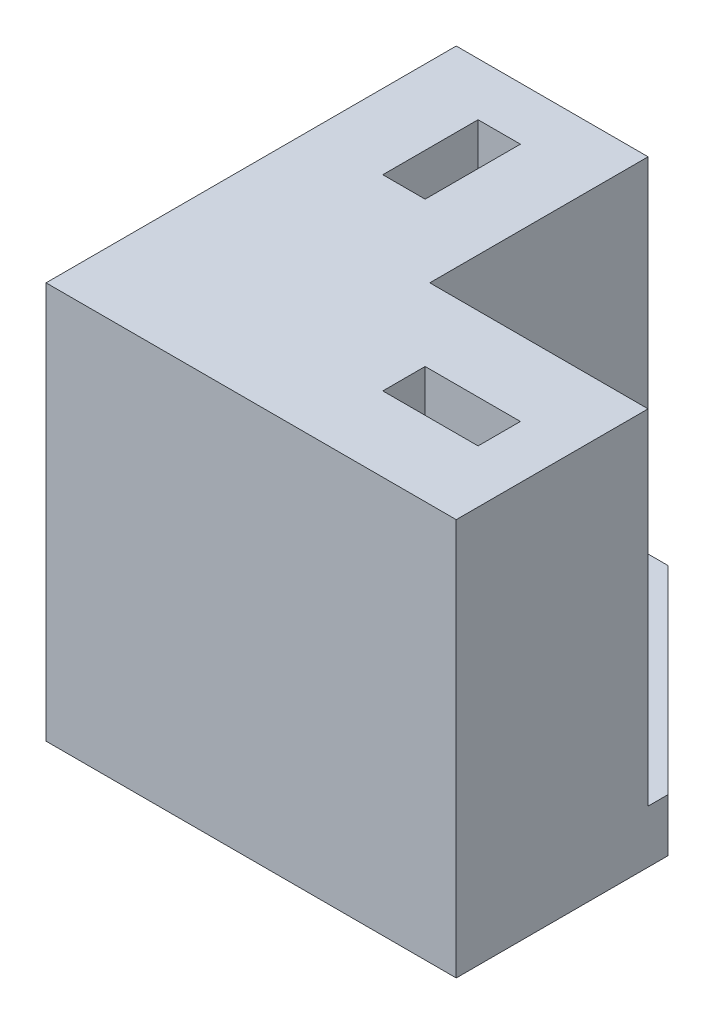
ISO-10303-21;
HEADER;
FILE_DESCRIPTION(('STEP AP214'),'2;1');
FILE_NAME('part.step','',(''),(''),'','','');
FILE_SCHEMA(('AUTOMOTIVE_DESIGN { 1 0 10303 214 1 1 1 1 }'));
ENDSEC;
DATA;
#1=APPLICATION_CONTEXT('core data for automotive mechanical design processes');
#2=APPLICATION_PROTOCOL_DEFINITION('international standard','automotive_design',2000,#1);
#3=PRODUCT_CONTEXT('',#1,'mechanical');
#4=PRODUCT('Part','Part','',(#3));
#5=PRODUCT_RELATED_PRODUCT_CATEGORY('part','',(#4));
#6=PRODUCT_DEFINITION_FORMATION('','',#4);
#7=PRODUCT_DEFINITION_CONTEXT('part definition',#1,'design');
#8=PRODUCT_DEFINITION('design','',#6,#7);
#9=PRODUCT_DEFINITION_SHAPE('','',#8);
#10=(LENGTH_UNIT() NAMED_UNIT(*) SI_UNIT(.MILLI.,.METRE.));
#11=(NAMED_UNIT(*) PLANE_ANGLE_UNIT() SI_UNIT($,.RADIAN.));
#12=(NAMED_UNIT(*) SI_UNIT($,.STERADIAN.) SOLID_ANGLE_UNIT());
#13=UNCERTAINTY_MEASURE_WITH_UNIT(LENGTH_MEASURE(1.E-05),#10,'distance_accuracy_value','');
#14=(GEOMETRIC_REPRESENTATION_CONTEXT(3) GLOBAL_UNCERTAINTY_ASSIGNED_CONTEXT((#13)) GLOBAL_UNIT_ASSIGNED_CONTEXT((#10,
#11,#12)) REPRESENTATION_CONTEXT('',''));
#15=CARTESIAN_POINT('',(0.,0.,0.));
#16=DIRECTION('',(0.,0.,1.));
#17=DIRECTION('',(1.,0.,0.));
#18=AXIS2_PLACEMENT_3D('',#15,#16,#17);
#19=CARTESIAN_POINT('',(9.8425,19.05,9.8425));
#20=DIRECTION('',(-1.,0.,0.));
#21=DIRECTION('',(0.,0.,1.));
#22=AXIS2_PLACEMENT_3D('',#19,#20,#21);
#23=PLANE('',#22);
#24=DIRECTION('',(0.,0.,-1.));
#25=VECTOR('',#24,1.);
#26=CARTESIAN_POINT('',(9.8425,0.,9.8425));
#27=LINE('',#26,#25);
#28=CARTESIAN_POINT('',(9.8425,0.,9.8425));
#29=VERTEX_POINT('',#28);
#30=CARTESIAN_POINT('',(9.8425,0.,-0.317499999999962));
#31=VERTEX_POINT('',#30);
#32=EDGE_CURVE('E287',#29,#31,#27,.T.);
#33=ORIENTED_EDGE('',*,*,#32,.T.);
#34=DIRECTION('',(0.,1.,0.));
#35=VECTOR('',#34,1.);
#36=CARTESIAN_POINT('',(9.8425,19.05,-0.317499999999962));
#37=LINE('',#36,#35);
#38=CARTESIAN_POINT('',(9.8425,2.54,-0.317499999999962));
#39=VERTEX_POINT('',#38);
#40=EDGE_CURVE('E48',#31,#39,#37,.T.);
#41=ORIENTED_EDGE('',*,*,#40,.T.);
#42=DIRECTION('',(0.,0.,-1.));
#43=VECTOR('',#42,1.);
#44=CARTESIAN_POINT('',(9.8425,2.54,-9.8425));
#45=LINE('',#44,#43);
#46=CARTESIAN_POINT('',(9.8425,2.54,0.634999999999998));
#47=VERTEX_POINT('',#46);
#48=EDGE_CURVE('E252',#47,#39,#45,.T.);
#49=ORIENTED_EDGE('',*,*,#48,.F.);
#50=DIRECTION('',(0.,1.,0.));
#51=VECTOR('',#50,1.);
#52=CARTESIAN_POINT('',(9.8425,2.54,0.634999999999998));
#53=LINE('',#52,#51);
#54=CARTESIAN_POINT('',(9.8425,19.05,0.634999999999998));
#55=VERTEX_POINT('',#54);
#56=EDGE_CURVE('E273',#47,#55,#53,.T.);
#57=ORIENTED_EDGE('',*,*,#56,.T.);
#58=DIRECTION('',(0.,0.,-1.));
#59=VECTOR('',#58,1.);
#60=CARTESIAN_POINT('',(9.8425,19.05,9.8425));
#61=LINE('',#60,#59);
#62=CARTESIAN_POINT('',(9.8425,19.05,9.8425));
#63=VERTEX_POINT('',#62);
#64=EDGE_CURVE('E291',#63,#55,#61,.T.);
#65=ORIENTED_EDGE('',*,*,#64,.F.);
#66=DIRECTION('',(0.,-1.,0.));
#67=VECTOR('',#66,1.);
#68=CARTESIAN_POINT('',(9.8425,19.05,9.8425));
#69=LINE('',#68,#67);
#70=EDGE_CURVE('E305',#63,#29,#69,.T.);
#71=ORIENTED_EDGE('',*,*,#70,.T.);
#72=EDGE_LOOP('',(#33,#41,#49,#57,#65,#71));
#73=FACE_BOUND('',#72,.T.);
#74=ADVANCED_FACE('F39',(#73),#23,.F.);
#75=CARTESIAN_POINT('',(-9.8425,19.05,-9.8425));
#76=DIRECTION('',(0.,0.,1.));
#77=DIRECTION('',(1.,0.,0.));
#78=AXIS2_PLACEMENT_3D('',#75,#76,#77);
#79=PLANE('',#78);
#80=DIRECTION('',(-1.,0.,0.));
#81=VECTOR('',#80,1.);
#82=CARTESIAN_POINT('',(-0.634999999999997,2.54,-9.8425));
#83=LINE('',#82,#81);
#84=CARTESIAN_POINT('',(0.3175,2.54,-9.8425));
#85=VERTEX_POINT('',#84);
#86=CARTESIAN_POINT('',(-0.634999999999997,2.54,-9.8425));
#87=VERTEX_POINT('',#86);
#88=EDGE_CURVE('E255',#85,#87,#83,.T.);
#89=ORIENTED_EDGE('',*,*,#88,.F.);
#90=DIRECTION('',(0.,-1.,0.));
#91=VECTOR('',#90,1.);
#92=CARTESIAN_POINT('',(0.3175,19.05,-9.8425));
#93=LINE('',#92,#91);
#94=CARTESIAN_POINT('',(0.3175,0.,-9.8425));
#95=VERTEX_POINT('',#94);
#96=EDGE_CURVE('E327',#85,#95,#93,.T.);
#97=ORIENTED_EDGE('',*,*,#96,.T.);
#98=DIRECTION('',(-1.,0.,0.));
#99=VECTOR('',#98,1.);
#100=CARTESIAN_POINT('',(-9.8425,0.,-9.8425));
#101=LINE('',#100,#99);
#102=CARTESIAN_POINT('',(-9.8425,0.,-9.8425));
#103=VERTEX_POINT('',#102);
#104=EDGE_CURVE('E308',#95,#103,#101,.T.);
#105=ORIENTED_EDGE('',*,*,#104,.T.);
#106=DIRECTION('',(0.,-1.,0.));
#107=VECTOR('',#106,1.);
#108=CARTESIAN_POINT('',(-9.8425,19.05,-9.8425));
#109=LINE('',#108,#107);
#110=CARTESIAN_POINT('',(-9.8425,19.05,-9.8425));
#111=VERTEX_POINT('',#110);
#112=EDGE_CURVE('E323',#111,#103,#109,.T.);
#113=ORIENTED_EDGE('',*,*,#112,.F.);
#114=DIRECTION('',(-1.,0.,0.));
#115=VECTOR('',#114,1.);
#116=CARTESIAN_POINT('',(-9.8425,19.05,-9.8425));
#117=LINE('',#116,#115);
#118=CARTESIAN_POINT('',(-0.634999999999997,19.05,-9.8425));
#119=VERTEX_POINT('',#118);
#120=EDGE_CURVE('E295',#119,#111,#117,.T.);
#121=ORIENTED_EDGE('',*,*,#120,.F.);
#122=DIRECTION('',(0.,1.,0.));
#123=VECTOR('',#122,1.);
#124=CARTESIAN_POINT('',(-0.634999999999997,2.54,-9.8425));
#125=LINE('',#124,#123);
#126=EDGE_CURVE('E267',#87,#119,#125,.T.);
#127=ORIENTED_EDGE('',*,*,#126,.F.);
#128=EDGE_LOOP('',(#89,#97,#105,#113,#121,#127));
#129=FACE_BOUND('',#128,.T.);
#130=ADVANCED_FACE('F336',(#129),#79,.F.);
#131=CARTESIAN_POINT('',(-9.8425,19.05,9.8425));
#132=DIRECTION('',(1.,0.,0.));
#133=DIRECTION('',(0.,0.,-1.));
#134=AXIS2_PLACEMENT_3D('',#131,#132,#133);
#135=PLANE('',#134);
#136=DIRECTION('',(0.,0.,1.));
#137=VECTOR('',#136,1.);
#138=CARTESIAN_POINT('',(-9.8425,0.,9.8425));
#139=LINE('',#138,#137);
#140=CARTESIAN_POINT('',(-9.8425,0.,9.8425));
#141=VERTEX_POINT('',#140);
#142=EDGE_CURVE('E311',#103,#141,#139,.T.);
#143=ORIENTED_EDGE('',*,*,#142,.T.);
#144=DIRECTION('',(0.,-1.,0.));
#145=VECTOR('',#144,1.);
#146=CARTESIAN_POINT('',(-9.8425,19.05,9.8425));
#147=LINE('',#146,#145);
#148=CARTESIAN_POINT('',(-9.8425,19.05,9.8425));
#149=VERTEX_POINT('',#148);
#150=EDGE_CURVE('E319',#149,#141,#147,.T.);
#151=ORIENTED_EDGE('',*,*,#150,.F.);
#152=DIRECTION('',(0.,0.,1.));
#153=VECTOR('',#152,1.);
#154=CARTESIAN_POINT('',(-9.8425,19.05,9.8425));
#155=LINE('',#154,#153);
#156=EDGE_CURVE('E299',#111,#149,#155,.T.);
#157=ORIENTED_EDGE('',*,*,#156,.F.);
#158=ORIENTED_EDGE('',*,*,#112,.T.);
#159=EDGE_LOOP('',(#143,#151,#157,#158));
#160=FACE_BOUND('',#159,.T.);
#161=ADVANCED_FACE('F346',(#160),#135,.F.);
#162=CARTESIAN_POINT('',(-9.8425,19.05,9.8425));
#163=DIRECTION('',(0.,0.,-1.));
#164=DIRECTION('',(-1.,0.,0.));
#165=AXIS2_PLACEMENT_3D('',#162,#163,#164);
#166=PLANE('',#165);
#167=DIRECTION('',(1.,0.,0.));
#168=VECTOR('',#167,1.);
#169=CARTESIAN_POINT('',(-9.8425,0.,9.8425));
#170=LINE('',#169,#168);
#171=EDGE_CURVE('E296',#141,#29,#170,.T.);
#172=ORIENTED_EDGE('',*,*,#171,.T.);
#173=ORIENTED_EDGE('',*,*,#70,.F.);
#174=DIRECTION('',(1.,0.,0.));
#175=VECTOR('',#174,1.);
#176=CARTESIAN_POINT('',(-9.8425,19.05,9.8425));
#177=LINE('',#176,#175);
#178=EDGE_CURVE('E302',#149,#63,#177,.T.);
#179=ORIENTED_EDGE('',*,*,#178,.F.);
#180=ORIENTED_EDGE('',*,*,#150,.T.);
#181=EDGE_LOOP('',(#172,#173,#179,#180));
#182=FACE_BOUND('',#181,.T.);
#183=ADVANCED_FACE('F350',(#182),#166,.F.);
#184=CARTESIAN_POINT('',(0.,19.05,0.));
#185=DIRECTION('',(0.,-1.,0.));
#186=DIRECTION('',(0.,0.,-1.));
#187=AXIS2_PLACEMENT_3D('',#184,#185,#186);
#188=PLANE('',#187);
#189=DIRECTION('',(-1.,0.,0.));
#190=VECTOR('',#189,1.);
#191=CARTESIAN_POINT('',(-6.25475,19.05,-7.3025));
#192=LINE('',#191,#190);
#193=CARTESIAN_POINT('',(-4.22275,19.05,-7.3025));
#194=VERTEX_POINT('',#193);
#195=CARTESIAN_POINT('',(-6.25475,19.05,-7.3025));
#196=VERTEX_POINT('',#195);
#197=EDGE_CURVE('E193',#194,#196,#192,.T.);
#198=ORIENTED_EDGE('',*,*,#197,.F.);
#199=DIRECTION('',(0.,0.,-1.));
#200=VECTOR('',#199,1.);
#201=CARTESIAN_POINT('',(-4.22275,19.05,-2.7305));
#202=LINE('',#201,#200);
#203=CARTESIAN_POINT('',(-4.22275,19.05,-2.7305));
#204=VERTEX_POINT('',#203);
#205=EDGE_CURVE('E160',#204,#194,#202,.T.);
#206=ORIENTED_EDGE('',*,*,#205,.F.);
#207=DIRECTION('',(1.,0.,0.));
#208=VECTOR('',#207,1.);
#209=CARTESIAN_POINT('',(-6.25475,19.05,-2.7305));
#210=LINE('',#209,#208);
#211=CARTESIAN_POINT('',(-6.25475,19.05,-2.7305));
#212=VERTEX_POINT('',#211);
#213=EDGE_CURVE('E180',#212,#204,#210,.T.);
#214=ORIENTED_EDGE('',*,*,#213,.F.);
#215=DIRECTION('',(0.,0.,1.));
#216=VECTOR('',#215,1.);
#217=CARTESIAN_POINT('',(-6.25475,19.05,-2.7305));
#218=LINE('',#217,#216);
#219=EDGE_CURVE('E184',#196,#212,#218,.T.);
#220=ORIENTED_EDGE('',*,*,#219,.F.);
#221=EDGE_LOOP('',(#198,#206,#214,#220));
#222=FACE_BOUND('',#221,.T.);
#223=DIRECTION('',(-1.,0.,0.));
#224=VECTOR('',#223,1.);
#225=CARTESIAN_POINT('',(2.7305,19.05,4.22275));
#226=LINE('',#225,#224);
#227=CARTESIAN_POINT('',(7.3025,19.05,4.22275));
#228=VERTEX_POINT('',#227);
#229=CARTESIAN_POINT('',(2.7305,19.05,4.22275));
#230=VERTEX_POINT('',#229);
#231=EDGE_CURVE('E230',#228,#230,#226,.T.);
#232=ORIENTED_EDGE('',*,*,#231,.F.);
#233=DIRECTION('',(0.,0.,-1.));
#234=VECTOR('',#233,1.);
#235=CARTESIAN_POINT('',(7.3025,19.05,6.25475));
#236=LINE('',#235,#234);
#237=CARTESIAN_POINT('',(7.3025,19.05,6.25475));
#238=VERTEX_POINT('',#237);
#239=EDGE_CURVE('E227',#238,#228,#236,.T.);
#240=ORIENTED_EDGE('',*,*,#239,.F.);
#241=DIRECTION('',(1.,0.,0.));
#242=VECTOR('',#241,1.);
#243=CARTESIAN_POINT('',(2.7305,19.05,6.25475));
#244=LINE('',#243,#242);
#245=CARTESIAN_POINT('',(2.7305,19.05,6.25475));
#246=VERTEX_POINT('',#245);
#247=EDGE_CURVE('E214',#246,#238,#244,.T.);
#248=ORIENTED_EDGE('',*,*,#247,.F.);
#249=DIRECTION('',(0.,0.,1.));
#250=VECTOR('',#249,1.);
#251=CARTESIAN_POINT('',(2.7305,19.05,6.25475));
#252=LINE('',#251,#250);
#253=EDGE_CURVE('E234',#230,#246,#252,.T.);
#254=ORIENTED_EDGE('',*,*,#253,.F.);
#255=EDGE_LOOP('',(#232,#240,#248,#254));
#256=FACE_BOUND('',#255,.T.);
#257=ORIENTED_EDGE('',*,*,#64,.T.);
#258=DIRECTION('',(1.,0.,0.));
#259=VECTOR('',#258,1.);
#260=CARTESIAN_POINT('',(9.8425,19.05,0.634999999999998));
#261=LINE('',#260,#259);
#262=CARTESIAN_POINT('',(-0.634999999999997,19.05,0.635));
#263=VERTEX_POINT('',#262);
#264=EDGE_CURVE('E256',#263,#55,#261,.T.);
#265=ORIENTED_EDGE('',*,*,#264,.F.);
#266=DIRECTION('',(0.,0.,1.));
#267=VECTOR('',#266,1.);
#268=CARTESIAN_POINT('',(-0.634999999999997,19.05,0.635));
#269=LINE('',#268,#267);
#270=EDGE_CURVE('E203',#119,#263,#269,.T.);
#271=ORIENTED_EDGE('',*,*,#270,.F.);
#272=ORIENTED_EDGE('',*,*,#120,.T.);
#273=ORIENTED_EDGE('',*,*,#156,.T.);
#274=ORIENTED_EDGE('',*,*,#178,.T.);
#275=EDGE_LOOP('',(#257,#265,#271,#272,#273,#274));
#276=FACE_BOUND('',#275,.T.);
#277=ADVANCED_FACE('F354',(#222,#256,#276),#188,.F.);
#278=CARTESIAN_POINT('',(0.,0.,0.));
#279=DIRECTION('',(0.,-1.,0.));
#280=DIRECTION('',(0.,0.,-1.));
#281=AXIS2_PLACEMENT_3D('',#278,#279,#280);
#282=PLANE('',#281);
#283=CARTESIAN_POINT('',(-4.92125,0.,4.92125));
#284=DIRECTION('',(0.,-1.,0.));
#285=DIRECTION('',(0.,0.,-1.));
#286=AXIS2_PLACEMENT_3D('',#283,#284,#285);
#287=CIRCLE('',#286,2.54);
#288=CARTESIAN_POINT('',(-4.92125,0.,2.38125));
#289=VERTEX_POINT('',#288);
#290=EDGE_CURVE('E277',#289,#289,#287,.T.);
#291=ORIENTED_EDGE('',*,*,#290,.F.);
#292=EDGE_LOOP('',(#291));
#293=FACE_BOUND('',#292,.T.);
#294=ORIENTED_EDGE('',*,*,#104,.F.);
#295=DIRECTION('',(-0.707106781186546,0.,-0.707106781186549));
#296=VECTOR('',#295,1.);
#297=CARTESIAN_POINT('',(5.08,0.,-5.07999999999998));
#298=LINE('',#297,#296);
#299=EDGE_CURVE('E62',#95,#31,#298,.F.);
#300=ORIENTED_EDGE('',*,*,#299,.T.);
#301=ORIENTED_EDGE('',*,*,#32,.F.);
#302=ORIENTED_EDGE('',*,*,#171,.F.);
#303=ORIENTED_EDGE('',*,*,#142,.F.);
#304=EDGE_LOOP('',(#294,#300,#301,#302,#303));
#305=FACE_BOUND('',#304,.T.);
#306=ADVANCED_FACE('F342',(#293,#305),#282,.T.);
#307=CARTESIAN_POINT('',(-4.92125,5.715,4.92125));
#308=DIRECTION('',(0.,-1.,0.));
#309=DIRECTION('',(0.,0.,-1.));
#310=AXIS2_PLACEMENT_3D('',#307,#308,#309);
#311=CYLINDRICAL_SURFACE('',#310,2.54);
#312=CARTESIAN_POINT('',(-4.92125,5.715,4.92125));
#313=DIRECTION('',(0.,-1.,0.));
#314=DIRECTION('',(0.,0.,-1.));
#315=AXIS2_PLACEMENT_3D('',#312,#313,#314);
#316=CIRCLE('',#315,2.54);
#317=CARTESIAN_POINT('',(-4.92125,5.715,2.38125));
#318=VERTEX_POINT('',#317);
#319=EDGE_CURVE('E283',#318,#318,#316,.T.);
#320=ORIENTED_EDGE('',*,*,#319,.F.);
#321=EDGE_LOOP('',(#320));
#322=FACE_BOUND('',#321,.T.);
#323=ORIENTED_EDGE('',*,*,#290,.T.);
#324=EDGE_LOOP('',(#323));
#325=FACE_BOUND('',#324,.T.);
#326=ADVANCED_FACE('F383',(#322,#325),#311,.F.);
#327=CARTESIAN_POINT('',(-4.92125,5.715,4.92125));
#328=DIRECTION('',(0.,-1.,0.));
#329=DIRECTION('',(0.,0.,-1.));
#330=AXIS2_PLACEMENT_3D('',#327,#328,#329);
#331=PLANE('',#330);
#332=ORIENTED_EDGE('',*,*,#319,.T.);
#333=EDGE_LOOP('',(#332));
#334=FACE_BOUND('',#333,.T.);
#335=ADVANCED_FACE('F390',(#334),#331,.T.);
#336=CARTESIAN_POINT('',(9.8425,2.54,0.634999999999998));
#337=DIRECTION('',(0.,0.,1.));
#338=DIRECTION('',(1.,0.,0.));
#339=AXIS2_PLACEMENT_3D('',#336,#337,#338);
#340=PLANE('',#339);
#341=ORIENTED_EDGE('',*,*,#264,.T.);
#342=ORIENTED_EDGE('',*,*,#56,.F.);
#343=DIRECTION('',(1.,0.,0.));
#344=VECTOR('',#343,1.);
#345=CARTESIAN_POINT('',(9.8425,2.54,0.634999999999998));
#346=LINE('',#345,#344);
#347=CARTESIAN_POINT('',(-0.634999999999997,2.54,0.635));
#348=VERTEX_POINT('',#347);
#349=EDGE_CURVE('E263',#348,#47,#346,.T.);
#350=ORIENTED_EDGE('',*,*,#349,.F.);
#351=DIRECTION('',(0.,1.,0.));
#352=VECTOR('',#351,1.);
#353=CARTESIAN_POINT('',(-0.634999999999997,2.54,0.635));
#354=LINE('',#353,#352);
#355=EDGE_CURVE('E278',#348,#263,#354,.T.);
#356=ORIENTED_EDGE('',*,*,#355,.T.);
#357=EDGE_LOOP('',(#341,#342,#350,#356));
#358=FACE_BOUND('',#357,.T.);
#359=ADVANCED_FACE('F365',(#358),#340,.F.);
#360=CARTESIAN_POINT('',(-0.634999999999997,2.54,0.635));
#361=DIRECTION('',(-1.,0.,0.));
#362=DIRECTION('',(0.,0.,1.));
#363=AXIS2_PLACEMENT_3D('',#360,#361,#362);
#364=PLANE('',#363);
#365=ORIENTED_EDGE('',*,*,#270,.T.);
#366=ORIENTED_EDGE('',*,*,#355,.F.);
#367=DIRECTION('',(0.,0.,1.));
#368=VECTOR('',#367,1.);
#369=CARTESIAN_POINT('',(-0.634999999999997,2.54,0.635));
#370=LINE('',#369,#368);
#371=EDGE_CURVE('E259',#87,#348,#370,.T.);
#372=ORIENTED_EDGE('',*,*,#371,.F.);
#373=ORIENTED_EDGE('',*,*,#126,.T.);
#374=EDGE_LOOP('',(#365,#366,#372,#373));
#375=FACE_BOUND('',#374,.T.);
#376=ADVANCED_FACE('F360',(#375),#364,.F.);
#377=CARTESIAN_POINT('',(0.,2.54,0.));
#378=DIRECTION('',(0.,-1.,0.));
#379=DIRECTION('',(0.,0.,-1.));
#380=AXIS2_PLACEMENT_3D('',#377,#378,#379);
#381=PLANE('',#380);
#382=ORIENTED_EDGE('',*,*,#48,.T.);
#383=DIRECTION('',(0.707106781186546,0.,0.707106781186549));
#384=VECTOR('',#383,1.);
#385=CARTESIAN_POINT('',(0.3175,2.54,-9.8425));
#386=LINE('',#385,#384);
#387=EDGE_CURVE('E11',#39,#85,#386,.F.);
#388=ORIENTED_EDGE('',*,*,#387,.T.);
#389=ORIENTED_EDGE('',*,*,#88,.T.);
#390=ORIENTED_EDGE('',*,*,#371,.T.);
#391=ORIENTED_EDGE('',*,*,#349,.T.);
#392=EDGE_LOOP('',(#382,#388,#389,#390,#391));
#393=FACE_BOUND('',#392,.T.);
#394=ADVANCED_FACE('F363',(#393),#381,.F.);
#395=CARTESIAN_POINT('',(7.3025,13.97,6.25475));
#396=DIRECTION('',(1.,0.,0.));
#397=DIRECTION('',(0.,0.,-1.));
#398=AXIS2_PLACEMENT_3D('',#395,#396,#397);
#399=PLANE('',#398);
#400=ORIENTED_EDGE('',*,*,#239,.T.);
#401=DIRECTION('',(0.,1.,0.));
#402=VECTOR('',#401,1.);
#403=CARTESIAN_POINT('',(7.3025,13.97,4.22275));
#404=LINE('',#403,#402);
#405=CARTESIAN_POINT('',(7.3025,13.97,4.22275));
#406=VERTEX_POINT('',#405);
#407=EDGE_CURVE('E226',#406,#228,#404,.T.);
#408=ORIENTED_EDGE('',*,*,#407,.F.);
#409=DIRECTION('',(0.,0.,-1.));
#410=VECTOR('',#409,1.);
#411=CARTESIAN_POINT('',(7.3025,13.97,6.25475));
#412=LINE('',#411,#410);
#413=CARTESIAN_POINT('',(7.3025,13.97,6.25475));
#414=VERTEX_POINT('',#413);
#415=EDGE_CURVE('E209',#414,#406,#412,.T.);
#416=ORIENTED_EDGE('',*,*,#415,.F.);
#417=DIRECTION('',(0.,1.,0.));
#418=VECTOR('',#417,1.);
#419=CARTESIAN_POINT('',(7.3025,13.97,6.25475));
#420=LINE('',#419,#418);
#421=EDGE_CURVE('E194',#414,#238,#420,.T.);
#422=ORIENTED_EDGE('',*,*,#421,.T.);
#423=EDGE_LOOP('',(#400,#408,#416,#422));
#424=FACE_BOUND('',#423,.T.);
#425=ADVANCED_FACE('F401',(#424),#399,.F.);
#426=CARTESIAN_POINT('',(2.7305,13.97,6.25475));
#427=DIRECTION('',(0.,0.,1.));
#428=DIRECTION('',(1.,0.,0.));
#429=AXIS2_PLACEMENT_3D('',#426,#427,#428);
#430=PLANE('',#429);
#431=ORIENTED_EDGE('',*,*,#247,.T.);
#432=ORIENTED_EDGE('',*,*,#421,.F.);
#433=DIRECTION('',(1.,0.,0.));
#434=VECTOR('',#433,1.);
#435=CARTESIAN_POINT('',(2.7305,13.97,6.25475));
#436=LINE('',#435,#434);
#437=CARTESIAN_POINT('',(2.7305,13.97,6.25475));
#438=VERTEX_POINT('',#437);
#439=EDGE_CURVE('E222',#438,#414,#436,.T.);
#440=ORIENTED_EDGE('',*,*,#439,.F.);
#441=DIRECTION('',(0.,1.,0.));
#442=VECTOR('',#441,1.);
#443=CARTESIAN_POINT('',(2.7305,13.97,6.25475));
#444=LINE('',#443,#442);
#445=EDGE_CURVE('E243',#438,#246,#444,.T.);
#446=ORIENTED_EDGE('',*,*,#445,.T.);
#447=EDGE_LOOP('',(#431,#432,#440,#446));
#448=FACE_BOUND('',#447,.T.);
#449=ADVANCED_FACE('F404',(#448),#430,.F.);
#450=CARTESIAN_POINT('',(2.7305,13.97,6.25475));
#451=DIRECTION('',(-1.,0.,0.));
#452=DIRECTION('',(0.,0.,1.));
#453=AXIS2_PLACEMENT_3D('',#450,#451,#452);
#454=PLANE('',#453);
#455=ORIENTED_EDGE('',*,*,#253,.T.);
#456=ORIENTED_EDGE('',*,*,#445,.F.);
#457=DIRECTION('',(0.,0.,1.));
#458=VECTOR('',#457,1.);
#459=CARTESIAN_POINT('',(2.7305,13.97,6.25475));
#460=LINE('',#459,#458);
#461=CARTESIAN_POINT('',(2.7305,13.97,4.22275));
#462=VERTEX_POINT('',#461);
#463=EDGE_CURVE('E218',#462,#438,#460,.T.);
#464=ORIENTED_EDGE('',*,*,#463,.F.);
#465=DIRECTION('',(0.,1.,0.));
#466=VECTOR('',#465,1.);
#467=CARTESIAN_POINT('',(2.7305,13.97,4.22275));
#468=LINE('',#467,#466);
#469=EDGE_CURVE('E246',#462,#230,#468,.T.);
#470=ORIENTED_EDGE('',*,*,#469,.T.);
#471=EDGE_LOOP('',(#455,#456,#464,#470));
#472=FACE_BOUND('',#471,.T.);
#473=ADVANCED_FACE('F410',(#472),#454,.F.);
#474=CARTESIAN_POINT('',(2.7305,13.97,4.22275));
#475=DIRECTION('',(0.,0.,-1.));
#476=DIRECTION('',(-1.,0.,0.));
#477=AXIS2_PLACEMENT_3D('',#474,#475,#476);
#478=PLANE('',#477);
#479=ORIENTED_EDGE('',*,*,#231,.T.);
#480=ORIENTED_EDGE('',*,*,#469,.F.);
#481=DIRECTION('',(-1.,0.,0.));
#482=VECTOR('',#481,1.);
#483=CARTESIAN_POINT('',(2.7305,13.97,4.22275));
#484=LINE('',#483,#482);
#485=EDGE_CURVE('E213',#406,#462,#484,.T.);
#486=ORIENTED_EDGE('',*,*,#485,.F.);
#487=ORIENTED_EDGE('',*,*,#407,.T.);
#488=EDGE_LOOP('',(#479,#480,#486,#487));
#489=FACE_BOUND('',#488,.T.);
#490=ADVANCED_FACE('F406',(#489),#478,.F.);
#491=CARTESIAN_POINT('',(0.,13.97,0.));
#492=DIRECTION('',(0.,-1.,0.));
#493=DIRECTION('',(0.,0.,-1.));
#494=AXIS2_PLACEMENT_3D('',#491,#492,#493);
#495=PLANE('',#494);
#496=ORIENTED_EDGE('',*,*,#415,.T.);
#497=ORIENTED_EDGE('',*,*,#485,.T.);
#498=ORIENTED_EDGE('',*,*,#463,.T.);
#499=ORIENTED_EDGE('',*,*,#439,.T.);
#500=EDGE_LOOP('',(#496,#497,#498,#499));
#501=FACE_BOUND('',#500,.T.);
#502=ADVANCED_FACE('F409',(#501),#495,.F.);
#503=CARTESIAN_POINT('',(-4.22275,13.97,-2.7305));
#504=DIRECTION('',(1.,0.,0.));
#505=DIRECTION('',(0.,0.,-1.));
#506=AXIS2_PLACEMENT_3D('',#503,#504,#505);
#507=PLANE('',#506);
#508=ORIENTED_EDGE('',*,*,#205,.T.);
#509=DIRECTION('',(0.,1.,0.));
#510=VECTOR('',#509,1.);
#511=CARTESIAN_POINT('',(-4.22275,13.97,-7.3025));
#512=LINE('',#511,#510);
#513=CARTESIAN_POINT('',(-4.22275,13.97,-7.3025));
#514=VERTEX_POINT('',#513);
#515=EDGE_CURVE('E153',#514,#194,#512,.T.);
#516=ORIENTED_EDGE('',*,*,#515,.F.);
#517=DIRECTION('',(0.,0.,-1.));
#518=VECTOR('',#517,1.);
#519=CARTESIAN_POINT('',(-4.22275,13.97,-2.7305));
#520=LINE('',#519,#518);
#521=CARTESIAN_POINT('',(-4.22275,13.97,-2.7305));
#522=VERTEX_POINT('',#521);
#523=EDGE_CURVE('E157',#522,#514,#520,.T.);
#524=ORIENTED_EDGE('',*,*,#523,.F.);
#525=DIRECTION('',(0.,1.,0.));
#526=VECTOR('',#525,1.);
#527=CARTESIAN_POINT('',(-4.22275,13.97,-2.7305));
#528=LINE('',#527,#526);
#529=EDGE_CURVE('E200',#522,#204,#528,.T.);
#530=ORIENTED_EDGE('',*,*,#529,.T.);
#531=EDGE_LOOP('',(#508,#516,#524,#530));
#532=FACE_BOUND('',#531,.T.);
#533=ADVANCED_FACE('F155',(#532),#507,.F.);
#534=CARTESIAN_POINT('',(-6.25475,13.97,-2.7305));
#535=DIRECTION('',(0.,0.,1.));
#536=DIRECTION('',(1.,0.,0.));
#537=AXIS2_PLACEMENT_3D('',#534,#535,#536);
#538=PLANE('',#537);
#539=ORIENTED_EDGE('',*,*,#213,.T.);
#540=ORIENTED_EDGE('',*,*,#529,.F.);
#541=DIRECTION('',(1.,0.,0.));
#542=VECTOR('',#541,1.);
#543=CARTESIAN_POINT('',(-6.25475,13.97,-2.7305));
#544=LINE('',#543,#542);
#545=CARTESIAN_POINT('',(-6.25475,13.97,-2.7305));
#546=VERTEX_POINT('',#545);
#547=EDGE_CURVE('E166',#546,#522,#544,.T.);
#548=ORIENTED_EDGE('',*,*,#547,.F.);
#549=DIRECTION('',(0.,1.,0.));
#550=VECTOR('',#549,1.);
#551=CARTESIAN_POINT('',(-6.25475,13.97,-2.7305));
#552=LINE('',#551,#550);
#553=EDGE_CURVE('E204',#546,#212,#552,.T.);
#554=ORIENTED_EDGE('',*,*,#553,.T.);
#555=EDGE_LOOP('',(#539,#540,#548,#554));
#556=FACE_BOUND('',#555,.T.);
#557=ADVANCED_FACE('F423',(#556),#538,.F.);
#558=CARTESIAN_POINT('',(-6.25475,13.97,-2.7305));
#559=DIRECTION('',(-1.,0.,0.));
#560=DIRECTION('',(0.,0.,1.));
#561=AXIS2_PLACEMENT_3D('',#558,#559,#560);
#562=PLANE('',#561);
#563=ORIENTED_EDGE('',*,*,#219,.T.);
#564=ORIENTED_EDGE('',*,*,#553,.F.);
#565=DIRECTION('',(0.,0.,1.));
#566=VECTOR('',#565,1.);
#567=CARTESIAN_POINT('',(-6.25475,13.97,-2.7305));
#568=LINE('',#567,#566);
#569=CARTESIAN_POINT('',(-6.25475,13.97,-7.3025));
#570=VERTEX_POINT('',#569);
#571=EDGE_CURVE('E175',#570,#546,#568,.T.);
#572=ORIENTED_EDGE('',*,*,#571,.F.);
#573=DIRECTION('',(0.,1.,0.));
#574=VECTOR('',#573,1.);
#575=CARTESIAN_POINT('',(-6.25475,13.97,-7.3025));
#576=LINE('',#575,#574);
#577=EDGE_CURVE('E165',#570,#196,#576,.T.);
#578=ORIENTED_EDGE('',*,*,#577,.T.);
#579=EDGE_LOOP('',(#563,#564,#572,#578));
#580=FACE_BOUND('',#579,.T.);
#581=ADVANCED_FACE('F426',(#580),#562,.F.);
#582=CARTESIAN_POINT('',(-6.25475,13.97,-7.3025));
#583=DIRECTION('',(0.,0.,-1.));
#584=DIRECTION('',(-1.,0.,0.));
#585=AXIS2_PLACEMENT_3D('',#582,#583,#584);
#586=PLANE('',#585);
#587=ORIENTED_EDGE('',*,*,#197,.T.);
#588=ORIENTED_EDGE('',*,*,#577,.F.);
#589=DIRECTION('',(-1.,0.,0.));
#590=VECTOR('',#589,1.);
#591=CARTESIAN_POINT('',(-6.25475,13.97,-7.3025));
#592=LINE('',#591,#590);
#593=EDGE_CURVE('E169',#514,#570,#592,.T.);
#594=ORIENTED_EDGE('',*,*,#593,.F.);
#595=ORIENTED_EDGE('',*,*,#515,.T.);
#596=EDGE_LOOP('',(#587,#588,#594,#595));
#597=FACE_BOUND('',#596,.T.);
#598=ADVANCED_FACE('F170',(#597),#586,.F.);
#599=CARTESIAN_POINT('',(0.,13.97,0.));
#600=DIRECTION('',(0.,-1.,0.));
#601=DIRECTION('',(0.,0.,-1.));
#602=AXIS2_PLACEMENT_3D('',#599,#600,#601);
#603=PLANE('',#602);
#604=ORIENTED_EDGE('',*,*,#523,.T.);
#605=ORIENTED_EDGE('',*,*,#593,.T.);
#606=ORIENTED_EDGE('',*,*,#571,.T.);
#607=ORIENTED_EDGE('',*,*,#547,.T.);
#608=EDGE_LOOP('',(#604,#605,#606,#607));
#609=FACE_BOUND('',#608,.T.);
#610=ADVANCED_FACE('F177',(#609),#603,.F.);
#611=CARTESIAN_POINT('',(0.3175,19.05,-9.8425));
#612=DIRECTION('',(-0.707106781186549,0.,0.707106781186546));
#613=DIRECTION('',(0.,-1.,0.));
#614=AXIS2_PLACEMENT_3D('',#611,#612,#613);
#615=PLANE('',#614);
#616=ORIENTED_EDGE('',*,*,#387,.F.);
#617=ORIENTED_EDGE('',*,*,#40,.F.);
#618=ORIENTED_EDGE('',*,*,#299,.F.);
#619=ORIENTED_EDGE('',*,*,#96,.F.);
#620=EDGE_LOOP('',(#616,#617,#618,#619));
#621=FACE_BOUND('',#620,.T.);
#622=ADVANCED_FACE('F41',(#621),#615,.F.);
#623=CLOSED_SHELL('',(#74,#130,#161,#183,#277,#306,#326,#335,#359,#376,#394,#425,#449,#473,#490,
#502,#533,#557,#581,#598,#610,#622));
#624=MANIFOLD_SOLID_BREP('B2',#623);
#625=ADVANCED_BREP_SHAPE_REPRESENTATION('',(#18,#624),#14);
#626=SHAPE_DEFINITION_REPRESENTATION(#9,#625);
ENDSEC;
END-ISO-10303-21;
